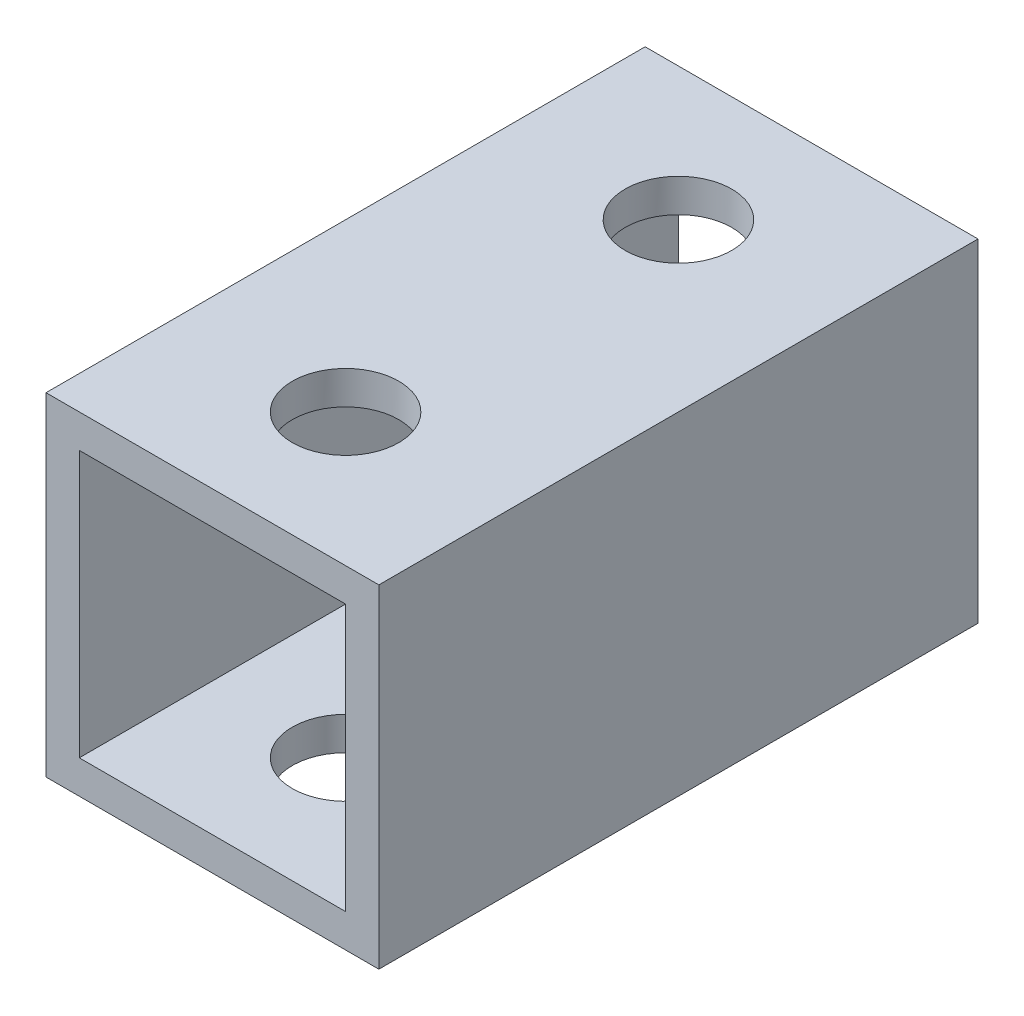
ISO-10303-21;
HEADER;
FILE_DESCRIPTION(('STEP AP214'),'2;1');
FILE_NAME('part.step','',(''),(''),'','','');
FILE_SCHEMA(('AUTOMOTIVE_DESIGN { 1 0 10303 214 1 1 1 1 }'));
ENDSEC;
DATA;
#1=APPLICATION_CONTEXT('core data for automotive mechanical design processes');
#2=APPLICATION_PROTOCOL_DEFINITION('international standard','automotive_design',2000,#1);
#3=PRODUCT_CONTEXT('',#1,'mechanical');
#4=PRODUCT('Part','Part','',(#3));
#5=PRODUCT_RELATED_PRODUCT_CATEGORY('part','',(#4));
#6=PRODUCT_DEFINITION_FORMATION('','',#4);
#7=PRODUCT_DEFINITION_CONTEXT('part definition',#1,'design');
#8=PRODUCT_DEFINITION('design','',#6,#7);
#9=PRODUCT_DEFINITION_SHAPE('','',#8);
#10=(LENGTH_UNIT() NAMED_UNIT(*) SI_UNIT(.MILLI.,.METRE.));
#11=(NAMED_UNIT(*) PLANE_ANGLE_UNIT() SI_UNIT($,.RADIAN.));
#12=(NAMED_UNIT(*) SI_UNIT($,.STERADIAN.) SOLID_ANGLE_UNIT());
#13=UNCERTAINTY_MEASURE_WITH_UNIT(LENGTH_MEASURE(1.E-05),#10,'distance_accuracy_value','');
#14=(GEOMETRIC_REPRESENTATION_CONTEXT(3) GLOBAL_UNCERTAINTY_ASSIGNED_CONTEXT((#13)) GLOBAL_UNIT_ASSIGNED_CONTEXT((#10,
#11,#12)) REPRESENTATION_CONTEXT('',''));
#15=CARTESIAN_POINT('',(0.,0.,0.));
#16=DIRECTION('',(0.,0.,1.));
#17=DIRECTION('',(1.,0.,0.));
#18=AXIS2_PLACEMENT_3D('',#15,#16,#17);
#19=CARTESIAN_POINT('',(0.,0.,18.));
#20=DIRECTION('',(0.,0.,1.));
#21=DIRECTION('',(1.,0.,0.));
#22=AXIS2_PLACEMENT_3D('',#19,#20,#21);
#23=PLANE('',#22);
#24=DIRECTION('',(0.,1.,0.));
#25=VECTOR('',#24,1.);
#26=CARTESIAN_POINT('',(5.,-5.,18.));
#27=LINE('',#26,#25);
#28=CARTESIAN_POINT('',(5.,-5.,18.));
#29=VERTEX_POINT('',#28);
#30=CARTESIAN_POINT('',(5.,5.,18.));
#31=VERTEX_POINT('',#30);
#32=EDGE_CURVE('E162',#29,#31,#27,.T.);
#33=ORIENTED_EDGE('',*,*,#32,.T.);
#34=DIRECTION('',(-1.,0.,0.));
#35=VECTOR('',#34,1.);
#36=CARTESIAN_POINT('',(-5.,5.,18.));
#37=LINE('',#36,#35);
#38=CARTESIAN_POINT('',(-5.,5.,18.));
#39=VERTEX_POINT('',#38);
#40=EDGE_CURVE('E165',#31,#39,#37,.T.);
#41=ORIENTED_EDGE('',*,*,#40,.T.);
#42=DIRECTION('',(0.,-1.,0.));
#43=VECTOR('',#42,1.);
#44=CARTESIAN_POINT('',(-5.,-5.,18.));
#45=LINE('',#44,#43);
#46=CARTESIAN_POINT('',(-5.,-5.,18.));
#47=VERTEX_POINT('',#46);
#48=EDGE_CURVE('E168',#39,#47,#45,.T.);
#49=ORIENTED_EDGE('',*,*,#48,.T.);
#50=DIRECTION('',(1.,0.,0.));
#51=VECTOR('',#50,1.);
#52=CARTESIAN_POINT('',(-5.,-5.,18.));
#53=LINE('',#52,#51);
#54=EDGE_CURVE('E170',#47,#29,#53,.T.);
#55=ORIENTED_EDGE('',*,*,#54,.T.);
#56=EDGE_LOOP('',(#33,#41,#49,#55));
#57=FACE_BOUND('',#56,.T.);
#58=DIRECTION('',(-1.,0.,0.));
#59=VECTOR('',#58,1.);
#60=CARTESIAN_POINT('',(0.,4.,18.));
#61=LINE('',#60,#59);
#62=CARTESIAN_POINT('',(4.,4.,18.));
#63=VERTEX_POINT('',#62);
#64=CARTESIAN_POINT('',(-4.,4.,18.));
#65=VERTEX_POINT('',#64);
#66=EDGE_CURVE('E132',#63,#65,#61,.T.);
#67=ORIENTED_EDGE('',*,*,#66,.F.);
#68=DIRECTION('',(0.,1.,0.));
#69=VECTOR('',#68,1.);
#70=CARTESIAN_POINT('',(4.,0.,18.));
#71=LINE('',#70,#69);
#72=CARTESIAN_POINT('',(4.,-4.,18.));
#73=VERTEX_POINT('',#72);
#74=EDGE_CURVE('E124',#73,#63,#71,.T.);
#75=ORIENTED_EDGE('',*,*,#74,.F.);
#76=DIRECTION('',(1.,0.,0.));
#77=VECTOR('',#76,1.);
#78=CARTESIAN_POINT('',(0.,-4.,18.));
#79=LINE('',#78,#77);
#80=CARTESIAN_POINT('',(-4.,-4.,18.));
#81=VERTEX_POINT('',#80);
#82=EDGE_CURVE('E146',#81,#73,#79,.T.);
#83=ORIENTED_EDGE('',*,*,#82,.F.);
#84=DIRECTION('',(0.,-1.,0.));
#85=VECTOR('',#84,1.);
#86=CARTESIAN_POINT('',(-4.,0.,18.));
#87=LINE('',#86,#85);
#88=EDGE_CURVE('E144',#65,#81,#87,.T.);
#89=ORIENTED_EDGE('',*,*,#88,.F.);
#90=EDGE_LOOP('',(#67,#75,#83,#89));
#91=FACE_BOUND('',#90,.T.);
#92=ADVANCED_FACE('F57',(#57,#91),#23,.T.);
#93=CARTESIAN_POINT('',(0.,0.,0.));
#94=DIRECTION('',(0.,0.,1.));
#95=DIRECTION('',(1.,0.,0.));
#96=AXIS2_PLACEMENT_3D('',#93,#94,#95);
#97=PLANE('',#96);
#98=DIRECTION('',(0.,1.,0.));
#99=VECTOR('',#98,1.);
#100=CARTESIAN_POINT('',(5.,-5.,0.));
#101=LINE('',#100,#99);
#102=CARTESIAN_POINT('',(5.,-5.,0.));
#103=VERTEX_POINT('',#102);
#104=CARTESIAN_POINT('',(5.,5.,0.));
#105=VERTEX_POINT('',#104);
#106=EDGE_CURVE('E140',#103,#105,#101,.T.);
#107=ORIENTED_EDGE('',*,*,#106,.F.);
#108=DIRECTION('',(1.,0.,0.));
#109=VECTOR('',#108,1.);
#110=CARTESIAN_POINT('',(-5.,-5.,0.));
#111=LINE('',#110,#109);
#112=CARTESIAN_POINT('',(-5.,-5.,0.));
#113=VERTEX_POINT('',#112);
#114=EDGE_CURVE('E166',#113,#103,#111,.T.);
#115=ORIENTED_EDGE('',*,*,#114,.F.);
#116=DIRECTION('',(0.,-1.,0.));
#117=VECTOR('',#116,1.);
#118=CARTESIAN_POINT('',(-5.,-5.,0.));
#119=LINE('',#118,#117);
#120=CARTESIAN_POINT('',(-5.,5.,0.));
#121=VERTEX_POINT('',#120);
#122=EDGE_CURVE('E177',#121,#113,#119,.T.);
#123=ORIENTED_EDGE('',*,*,#122,.F.);
#124=DIRECTION('',(-1.,0.,0.));
#125=VECTOR('',#124,1.);
#126=CARTESIAN_POINT('',(-5.,5.,0.));
#127=LINE('',#126,#125);
#128=EDGE_CURVE('E175',#105,#121,#127,.T.);
#129=ORIENTED_EDGE('',*,*,#128,.F.);
#130=EDGE_LOOP('',(#107,#115,#123,#129));
#131=FACE_BOUND('',#130,.T.);
#132=DIRECTION('',(0.,1.,0.));
#133=VECTOR('',#132,1.);
#134=CARTESIAN_POINT('',(4.,0.,0.));
#135=LINE('',#134,#133);
#136=CARTESIAN_POINT('',(4.,-4.,0.));
#137=VERTEX_POINT('',#136);
#138=CARTESIAN_POINT('',(4.,4.,0.));
#139=VERTEX_POINT('',#138);
#140=EDGE_CURVE('E82',#137,#139,#135,.T.);
#141=ORIENTED_EDGE('',*,*,#140,.T.);
#142=DIRECTION('',(-1.,0.,0.));
#143=VECTOR('',#142,1.);
#144=CARTESIAN_POINT('',(0.,4.,0.));
#145=LINE('',#144,#143);
#146=CARTESIAN_POINT('',(-4.,4.,0.));
#147=VERTEX_POINT('',#146);
#148=EDGE_CURVE('E139',#139,#147,#145,.T.);
#149=ORIENTED_EDGE('',*,*,#148,.T.);
#150=DIRECTION('',(0.,-1.,0.));
#151=VECTOR('',#150,1.);
#152=CARTESIAN_POINT('',(-4.,0.,0.));
#153=LINE('',#152,#151);
#154=CARTESIAN_POINT('',(-4.,-4.,0.));
#155=VERTEX_POINT('',#154);
#156=EDGE_CURVE('E154',#147,#155,#153,.T.);
#157=ORIENTED_EDGE('',*,*,#156,.T.);
#158=DIRECTION('',(1.,0.,0.));
#159=VECTOR('',#158,1.);
#160=CARTESIAN_POINT('',(0.,-4.,0.));
#161=LINE('',#160,#159);
#162=EDGE_CURVE('E133',#155,#137,#161,.T.);
#163=ORIENTED_EDGE('',*,*,#162,.T.);
#164=EDGE_LOOP('',(#141,#149,#157,#163));
#165=FACE_BOUND('',#164,.T.);
#166=ADVANCED_FACE('F224',(#131,#165),#97,.F.);
#167=CARTESIAN_POINT('',(5.,-5.,18.));
#168=DIRECTION('',(-1.,0.,0.));
#169=DIRECTION('',(0.,0.,1.));
#170=AXIS2_PLACEMENT_3D('',#167,#168,#169);
#171=PLANE('',#170);
#172=ORIENTED_EDGE('',*,*,#106,.T.);
#173=DIRECTION('',(0.,0.,-1.));
#174=VECTOR('',#173,1.);
#175=CARTESIAN_POINT('',(5.,5.,18.));
#176=LINE('',#175,#174);
#177=EDGE_CURVE('E12',#31,#105,#176,.T.);
#178=ORIENTED_EDGE('',*,*,#177,.F.);
#179=ORIENTED_EDGE('',*,*,#32,.F.);
#180=DIRECTION('',(0.,0.,-1.));
#181=VECTOR('',#180,1.);
#182=CARTESIAN_POINT('',(5.,-5.,18.));
#183=LINE('',#182,#181);
#184=EDGE_CURVE('E172',#29,#103,#183,.T.);
#185=ORIENTED_EDGE('',*,*,#184,.T.);
#186=EDGE_LOOP('',(#172,#178,#179,#185));
#187=FACE_BOUND('',#186,.T.);
#188=ADVANCED_FACE('F59',(#187),#171,.F.);
#189=CARTESIAN_POINT('',(-5.,5.,18.));
#190=DIRECTION('',(0.,-1.,0.));
#191=DIRECTION('',(0.,0.,-1.));
#192=AXIS2_PLACEMENT_3D('',#189,#190,#191);
#193=PLANE('',#192);
#194=CARTESIAN_POINT('',(0.,5.,4.));
#195=DIRECTION('',(0.,1.,0.));
#196=DIRECTION('',(0.,0.,1.));
#197=AXIS2_PLACEMENT_3D('',#194,#195,#196);
#198=CIRCLE('',#197,1.6);
#199=CARTESIAN_POINT('',(0.,5.,5.6));
#200=VERTEX_POINT('',#199);
#201=EDGE_CURVE('E195',#200,#200,#198,.T.);
#202=ORIENTED_EDGE('',*,*,#201,.F.);
#203=EDGE_LOOP('',(#202));
#204=FACE_BOUND('',#203,.T.);
#205=CARTESIAN_POINT('',(0.,5.,14.));
#206=DIRECTION('',(0.,1.,0.));
#207=DIRECTION('',(0.,0.,1.));
#208=AXIS2_PLACEMENT_3D('',#205,#206,#207);
#209=CIRCLE('',#208,1.6);
#210=CARTESIAN_POINT('',(0.,5.,15.6));
#211=VERTEX_POINT('',#210);
#212=EDGE_CURVE('E205',#211,#211,#209,.T.);
#213=ORIENTED_EDGE('',*,*,#212,.F.);
#214=EDGE_LOOP('',(#213));
#215=FACE_BOUND('',#214,.T.);
#216=ORIENTED_EDGE('',*,*,#128,.T.);
#217=DIRECTION('',(0.,0.,-1.));
#218=VECTOR('',#217,1.);
#219=CARTESIAN_POINT('',(-5.,5.,18.));
#220=LINE('',#219,#218);
#221=EDGE_CURVE('E66',#39,#121,#220,.T.);
#222=ORIENTED_EDGE('',*,*,#221,.F.);
#223=ORIENTED_EDGE('',*,*,#40,.F.);
#224=ORIENTED_EDGE('',*,*,#177,.T.);
#225=EDGE_LOOP('',(#216,#222,#223,#224));
#226=FACE_BOUND('',#225,.T.);
#227=ADVANCED_FACE('F248',(#204,#215,#226),#193,.F.);
#228=CARTESIAN_POINT('',(-5.,-5.,18.));
#229=DIRECTION('',(1.,0.,0.));
#230=DIRECTION('',(0.,0.,-1.));
#231=AXIS2_PLACEMENT_3D('',#228,#229,#230);
#232=PLANE('',#231);
#233=ORIENTED_EDGE('',*,*,#122,.T.);
#234=DIRECTION('',(0.,0.,-1.));
#235=VECTOR('',#234,1.);
#236=CARTESIAN_POINT('',(-5.,-5.,18.));
#237=LINE('',#236,#235);
#238=EDGE_CURVE('E182',#47,#113,#237,.T.);
#239=ORIENTED_EDGE('',*,*,#238,.F.);
#240=ORIENTED_EDGE('',*,*,#48,.F.);
#241=ORIENTED_EDGE('',*,*,#221,.T.);
#242=EDGE_LOOP('',(#233,#239,#240,#241));
#243=FACE_BOUND('',#242,.T.);
#244=ADVANCED_FACE('F246',(#243),#232,.F.);
#245=CARTESIAN_POINT('',(-5.,-5.,18.));
#246=DIRECTION('',(0.,1.,0.));
#247=DIRECTION('',(0.,0.,1.));
#248=AXIS2_PLACEMENT_3D('',#245,#246,#247);
#249=PLANE('',#248);
#250=CARTESIAN_POINT('',(0.,-5.,4.));
#251=DIRECTION('',(0.,1.,0.));
#252=DIRECTION('',(0.,0.,1.));
#253=AXIS2_PLACEMENT_3D('',#250,#251,#252);
#254=CIRCLE('',#253,1.6);
#255=CARTESIAN_POINT('',(0.,-5.,5.6));
#256=VERTEX_POINT('',#255);
#257=EDGE_CURVE('E189',#256,#256,#254,.T.);
#258=ORIENTED_EDGE('',*,*,#257,.T.);
#259=EDGE_LOOP('',(#258));
#260=FACE_BOUND('',#259,.T.);
#261=CARTESIAN_POINT('',(0.,-5.,14.));
#262=DIRECTION('',(0.,1.,0.));
#263=DIRECTION('',(0.,0.,1.));
#264=AXIS2_PLACEMENT_3D('',#261,#262,#263);
#265=CIRCLE('',#264,1.6);
#266=CARTESIAN_POINT('',(0.,-5.,15.6));
#267=VERTEX_POINT('',#266);
#268=EDGE_CURVE('E200',#267,#267,#265,.T.);
#269=ORIENTED_EDGE('',*,*,#268,.T.);
#270=EDGE_LOOP('',(#269));
#271=FACE_BOUND('',#270,.T.);
#272=ORIENTED_EDGE('',*,*,#114,.T.);
#273=ORIENTED_EDGE('',*,*,#184,.F.);
#274=ORIENTED_EDGE('',*,*,#54,.F.);
#275=ORIENTED_EDGE('',*,*,#238,.T.);
#276=EDGE_LOOP('',(#272,#273,#274,#275));
#277=FACE_BOUND('',#276,.T.);
#278=ADVANCED_FACE('F243',(#260,#271,#277),#249,.F.);
#279=CARTESIAN_POINT('',(4.,0.,18.));
#280=DIRECTION('',(-1.,0.,0.));
#281=DIRECTION('',(0.,0.,1.));
#282=AXIS2_PLACEMENT_3D('',#279,#280,#281);
#283=PLANE('',#282);
#284=ORIENTED_EDGE('',*,*,#140,.F.);
#285=DIRECTION('',(0.,0.,-1.));
#286=VECTOR('',#285,1.);
#287=CARTESIAN_POINT('',(4.,-4.,18.));
#288=LINE('',#287,#286);
#289=EDGE_CURVE('E128',#73,#137,#288,.T.);
#290=ORIENTED_EDGE('',*,*,#289,.F.);
#291=ORIENTED_EDGE('',*,*,#74,.T.);
#292=DIRECTION('',(0.,0.,-1.));
#293=VECTOR('',#292,1.);
#294=CARTESIAN_POINT('',(4.,4.,18.));
#295=LINE('',#294,#293);
#296=EDGE_CURVE('E127',#63,#139,#295,.T.);
#297=ORIENTED_EDGE('',*,*,#296,.T.);
#298=EDGE_LOOP('',(#284,#290,#291,#297));
#299=FACE_BOUND('',#298,.T.);
#300=ADVANCED_FACE('F126',(#299),#283,.T.);
#301=CARTESIAN_POINT('',(0.,4.,18.));
#302=DIRECTION('',(0.,-1.,0.));
#303=DIRECTION('',(0.,0.,-1.));
#304=AXIS2_PLACEMENT_3D('',#301,#302,#303);
#305=PLANE('',#304);
#306=CARTESIAN_POINT('',(0.,4.,4.));
#307=DIRECTION('',(0.,-1.,0.));
#308=DIRECTION('',(0.,0.,-1.));
#309=AXIS2_PLACEMENT_3D('',#306,#307,#308);
#310=CIRCLE('',#309,1.6);
#311=CARTESIAN_POINT('',(0.,4.,2.4));
#312=VERTEX_POINT('',#311);
#313=EDGE_CURVE('E152',#312,#312,#310,.T.);
#314=ORIENTED_EDGE('',*,*,#313,.F.);
#315=EDGE_LOOP('',(#314));
#316=FACE_BOUND('',#315,.T.);
#317=CARTESIAN_POINT('',(0.,4.,14.));
#318=DIRECTION('',(0.,-1.,0.));
#319=DIRECTION('',(0.,0.,-1.));
#320=AXIS2_PLACEMENT_3D('',#317,#318,#319);
#321=CIRCLE('',#320,1.6);
#322=CARTESIAN_POINT('',(0.,4.,12.4));
#323=VERTEX_POINT('',#322);
#324=EDGE_CURVE('E188',#323,#323,#321,.T.);
#325=ORIENTED_EDGE('',*,*,#324,.F.);
#326=EDGE_LOOP('',(#325));
#327=FACE_BOUND('',#326,.T.);
#328=ORIENTED_EDGE('',*,*,#148,.F.);
#329=ORIENTED_EDGE('',*,*,#296,.F.);
#330=ORIENTED_EDGE('',*,*,#66,.T.);
#331=DIRECTION('',(0.,0.,-1.));
#332=VECTOR('',#331,1.);
#333=CARTESIAN_POINT('',(-4.,4.,18.));
#334=LINE('',#333,#332);
#335=EDGE_CURVE('E141',#65,#147,#334,.T.);
#336=ORIENTED_EDGE('',*,*,#335,.T.);
#337=EDGE_LOOP('',(#328,#329,#330,#336));
#338=FACE_BOUND('',#337,.T.);
#339=ADVANCED_FACE('F136',(#316,#327,#338),#305,.T.);
#340=CARTESIAN_POINT('',(-4.,0.,18.));
#341=DIRECTION('',(1.,0.,0.));
#342=DIRECTION('',(0.,0.,-1.));
#343=AXIS2_PLACEMENT_3D('',#340,#341,#342);
#344=PLANE('',#343);
#345=ORIENTED_EDGE('',*,*,#156,.F.);
#346=ORIENTED_EDGE('',*,*,#335,.F.);
#347=ORIENTED_EDGE('',*,*,#88,.T.);
#348=DIRECTION('',(0.,0.,-1.));
#349=VECTOR('',#348,1.);
#350=CARTESIAN_POINT('',(-4.,-4.,18.));
#351=LINE('',#350,#349);
#352=EDGE_CURVE('E74',#81,#155,#351,.T.);
#353=ORIENTED_EDGE('',*,*,#352,.T.);
#354=EDGE_LOOP('',(#345,#346,#347,#353));
#355=FACE_BOUND('',#354,.T.);
#356=ADVANCED_FACE('F220',(#355),#344,.T.);
#357=CARTESIAN_POINT('',(0.,-4.,18.));
#358=DIRECTION('',(0.,1.,0.));
#359=DIRECTION('',(0.,0.,1.));
#360=AXIS2_PLACEMENT_3D('',#357,#358,#359);
#361=PLANE('',#360);
#362=CARTESIAN_POINT('',(0.,-4.,4.));
#363=DIRECTION('',(0.,1.,0.));
#364=DIRECTION('',(0.,0.,1.));
#365=AXIS2_PLACEMENT_3D('',#362,#363,#364);
#366=CIRCLE('',#365,1.6);
#367=CARTESIAN_POINT('',(0.,-4.,5.6));
#368=VERTEX_POINT('',#367);
#369=EDGE_CURVE('E61',#368,#368,#366,.T.);
#370=ORIENTED_EDGE('',*,*,#369,.F.);
#371=EDGE_LOOP('',(#370));
#372=FACE_BOUND('',#371,.T.);
#373=CARTESIAN_POINT('',(0.,-4.,14.));
#374=DIRECTION('',(0.,1.,0.));
#375=DIRECTION('',(0.,0.,1.));
#376=AXIS2_PLACEMENT_3D('',#373,#374,#375);
#377=CIRCLE('',#376,1.6);
#378=CARTESIAN_POINT('',(0.,-4.,15.6));
#379=VERTEX_POINT('',#378);
#380=EDGE_CURVE('E186',#379,#379,#377,.T.);
#381=ORIENTED_EDGE('',*,*,#380,.F.);
#382=EDGE_LOOP('',(#381));
#383=FACE_BOUND('',#382,.T.);
#384=ORIENTED_EDGE('',*,*,#162,.F.);
#385=ORIENTED_EDGE('',*,*,#352,.F.);
#386=ORIENTED_EDGE('',*,*,#82,.T.);
#387=ORIENTED_EDGE('',*,*,#289,.T.);
#388=EDGE_LOOP('',(#384,#385,#386,#387));
#389=FACE_BOUND('',#388,.T.);
#390=ADVANCED_FACE('F216',(#372,#383,#389),#361,.T.);
#391=CARTESIAN_POINT('',(0.,-5.,14.));
#392=DIRECTION('',(0.,1.,0.));
#393=DIRECTION('',(0.,0.,1.));
#394=AXIS2_PLACEMENT_3D('',#391,#392,#393);
#395=CYLINDRICAL_SURFACE('',#394,1.6);
#396=ORIENTED_EDGE('',*,*,#380,.T.);
#397=EDGE_LOOP('',(#396));
#398=FACE_BOUND('',#397,.T.);
#399=ORIENTED_EDGE('',*,*,#268,.F.);
#400=EDGE_LOOP('',(#399));
#401=FACE_BOUND('',#400,.T.);
#402=ADVANCED_FACE('F219',(#398,#401),#395,.F.);
#403=CARTESIAN_POINT('',(0.,-5.,4.));
#404=DIRECTION('',(0.,1.,0.));
#405=DIRECTION('',(0.,0.,1.));
#406=AXIS2_PLACEMENT_3D('',#403,#404,#405);
#407=CYLINDRICAL_SURFACE('',#406,1.6);
#408=ORIENTED_EDGE('',*,*,#369,.T.);
#409=EDGE_LOOP('',(#408));
#410=FACE_BOUND('',#409,.T.);
#411=ORIENTED_EDGE('',*,*,#257,.F.);
#412=EDGE_LOOP('',(#411));
#413=FACE_BOUND('',#412,.T.);
#414=ADVANCED_FACE('F213',(#410,#413),#407,.F.);
#415=ORIENTED_EDGE('',*,*,#324,.T.);
#416=EDGE_LOOP('',(#415));
#417=FACE_BOUND('',#416,.T.);
#418=ORIENTED_EDGE('',*,*,#212,.T.);
#419=EDGE_LOOP('',(#418));
#420=FACE_BOUND('',#419,.T.);
#421=ADVANCED_FACE('F272',(#417,#420),#395,.F.);
#422=ORIENTED_EDGE('',*,*,#313,.T.);
#423=EDGE_LOOP('',(#422));
#424=FACE_BOUND('',#423,.T.);
#425=ORIENTED_EDGE('',*,*,#201,.T.);
#426=EDGE_LOOP('',(#425));
#427=FACE_BOUND('',#426,.T.);
#428=ADVANCED_FACE('F274',(#424,#427),#407,.F.);
#429=CLOSED_SHELL('',(#92,#166,#188,#227,#244,#278,#300,#339,#356,#390,#402,#414,#421,#428));
#430=MANIFOLD_SOLID_BREP('B2',#429);
#431=ADVANCED_BREP_SHAPE_REPRESENTATION('',(#18,#430),#14);
#432=SHAPE_DEFINITION_REPRESENTATION(#9,#431);
ENDSEC;
END-ISO-10303-21;
